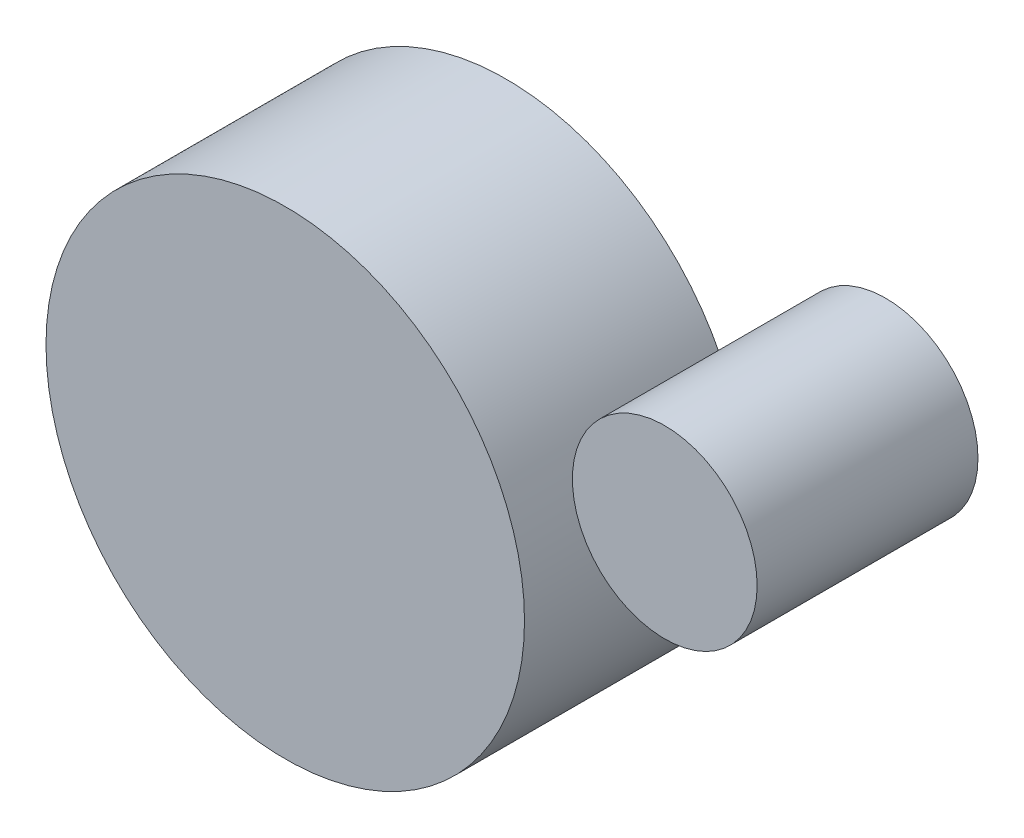
ISO-10303-21;
HEADER;
FILE_DESCRIPTION(('STEP AP214'),'2;1');
FILE_NAME('part.step','',(''),(''),'','','');
FILE_SCHEMA(('AUTOMOTIVE_DESIGN { 1 0 10303 214 1 1 1 1 }'));
ENDSEC;
DATA;
#1=APPLICATION_CONTEXT('core data for automotive mechanical design processes');
#2=APPLICATION_PROTOCOL_DEFINITION('international standard','automotive_design',2000,#1);
#3=PRODUCT_CONTEXT('',#1,'mechanical');
#4=PRODUCT('Part','Part','',(#3));
#5=PRODUCT_RELATED_PRODUCT_CATEGORY('part','',(#4));
#6=PRODUCT_DEFINITION_FORMATION('','',#4);
#7=PRODUCT_DEFINITION_CONTEXT('part definition',#1,'design');
#8=PRODUCT_DEFINITION('design','',#6,#7);
#9=PRODUCT_DEFINITION_SHAPE('','',#8);
#10=(LENGTH_UNIT() NAMED_UNIT(*) SI_UNIT(.MILLI.,.METRE.));
#11=(NAMED_UNIT(*) PLANE_ANGLE_UNIT() SI_UNIT($,.RADIAN.));
#12=(NAMED_UNIT(*) SI_UNIT($,.STERADIAN.) SOLID_ANGLE_UNIT());
#13=UNCERTAINTY_MEASURE_WITH_UNIT(LENGTH_MEASURE(1.E-05),#10,'distance_accuracy_value','');
#14=(GEOMETRIC_REPRESENTATION_CONTEXT(3) GLOBAL_UNCERTAINTY_ASSIGNED_CONTEXT((#13)) GLOBAL_UNIT_ASSIGNED_CONTEXT((#10,
#11,#12)) REPRESENTATION_CONTEXT('',''));
#15=CARTESIAN_POINT('',(0.,0.,0.));
#16=DIRECTION('',(0.,0.,1.));
#17=DIRECTION('',(1.,0.,0.));
#18=AXIS2_PLACEMENT_3D('',#15,#16,#17);
#19=CARTESIAN_POINT('',(-6.65,7.05000000000002,30.));
#20=DIRECTION('',(0.,0.,-1.));
#21=DIRECTION('',(-1.,0.,0.));
#22=AXIS2_PLACEMENT_3D('',#19,#20,#21);
#23=CYLINDRICAL_SURFACE('',#22,32.5000000000002);
#24=CARTESIAN_POINT('',(-6.65,7.05000000000002,30.));
#25=DIRECTION('',(0.,0.,1.));
#26=DIRECTION('',(1.,0.,0.));
#27=AXIS2_PLACEMENT_3D('',#24,#25,#26);
#28=CIRCLE('',#27,32.5000000000002);
#29=CARTESIAN_POINT('',(25.8500000000002,7.05000000000002,30.));
#30=VERTEX_POINT('',#29);
#31=EDGE_CURVE('E11',#30,#30,#28,.T.);
#32=ORIENTED_EDGE('',*,*,#31,.F.);
#33=EDGE_LOOP('',(#32));
#34=FACE_BOUND('',#33,.T.);
#35=CARTESIAN_POINT('',(-6.65,7.05000000000002,0.));
#36=DIRECTION('',(0.,0.,1.));
#37=DIRECTION('',(1.,0.,0.));
#38=AXIS2_PLACEMENT_3D('',#35,#36,#37);
#39=CIRCLE('',#38,32.5000000000002);
#40=CARTESIAN_POINT('',(25.8500000000002,7.05000000000002,0.));
#41=VERTEX_POINT('',#40);
#42=EDGE_CURVE('E42',#41,#41,#39,.T.);
#43=ORIENTED_EDGE('',*,*,#42,.T.);
#44=EDGE_LOOP('',(#43));
#45=FACE_BOUND('',#44,.T.);
#46=ADVANCED_FACE('F39',(#34,#45),#23,.T.);
#47=CARTESIAN_POINT('',(-6.65,7.05000000000002,30.));
#48=DIRECTION('',(0.,0.,1.));
#49=DIRECTION('',(1.,0.,0.));
#50=AXIS2_PLACEMENT_3D('',#47,#48,#49);
#51=PLANE('',#50);
#52=ORIENTED_EDGE('',*,*,#31,.T.);
#53=EDGE_LOOP('',(#52));
#54=FACE_BOUND('',#53,.T.);
#55=ADVANCED_FACE('F54',(#54),#51,.T.);
#56=CARTESIAN_POINT('',(-6.65,7.05000000000002,0.));
#57=DIRECTION('',(0.,0.,1.));
#58=DIRECTION('',(1.,0.,0.));
#59=AXIS2_PLACEMENT_3D('',#56,#57,#58);
#60=PLANE('',#59);
#61=ORIENTED_EDGE('',*,*,#42,.F.);
#62=EDGE_LOOP('',(#61));
#63=FACE_BOUND('',#62,.T.);
#64=ADVANCED_FACE('F52',(#63),#60,.F.);
#65=CLOSED_SHELL('',(#46,#55,#64));
#66=MANIFOLD_SOLID_BREP('B2',#65);
#67=CARTESIAN_POINT('',(44.9,26.9999999999999,30.));
#68=DIRECTION('',(0.,0.,-1.));
#69=DIRECTION('',(-1.,0.,0.));
#70=AXIS2_PLACEMENT_3D('',#67,#68,#69);
#71=CYLINDRICAL_SURFACE('',#70,12.5500000000003);
#72=CARTESIAN_POINT('',(44.9,26.9999999999999,30.));
#73=DIRECTION('',(0.,0.,1.));
#74=DIRECTION('',(1.,0.,0.));
#75=AXIS2_PLACEMENT_3D('',#72,#73,#74);
#76=CIRCLE('',#75,12.5500000000003);
#77=CARTESIAN_POINT('',(57.4500000000003,26.9999999999999,30.));
#78=VERTEX_POINT('',#77);
#79=EDGE_CURVE('E38',#78,#78,#76,.T.);
#80=ORIENTED_EDGE('',*,*,#79,.F.);
#81=EDGE_LOOP('',(#80));
#82=FACE_BOUND('',#81,.T.);
#83=CARTESIAN_POINT('',(44.9,26.9999999999999,0.));
#84=DIRECTION('',(0.,0.,1.));
#85=DIRECTION('',(1.,0.,0.));
#86=AXIS2_PLACEMENT_3D('',#83,#84,#85);
#87=CIRCLE('',#86,12.5500000000003);
#88=CARTESIAN_POINT('',(57.4500000000003,26.9999999999999,0.));
#89=VERTEX_POINT('',#88);
#90=EDGE_CURVE('E83',#89,#89,#87,.T.);
#91=ORIENTED_EDGE('',*,*,#90,.T.);
#92=EDGE_LOOP('',(#91));
#93=FACE_BOUND('',#92,.T.);
#94=ADVANCED_FACE('F80',(#82,#93),#71,.T.);
#95=CARTESIAN_POINT('',(44.9,26.9999999999999,30.));
#96=DIRECTION('',(0.,0.,1.));
#97=DIRECTION('',(1.,0.,0.));
#98=AXIS2_PLACEMENT_3D('',#95,#96,#97);
#99=PLANE('',#98);
#100=ORIENTED_EDGE('',*,*,#79,.T.);
#101=EDGE_LOOP('',(#100));
#102=FACE_BOUND('',#101,.T.);
#103=ADVANCED_FACE('F95',(#102),#99,.T.);
#104=CARTESIAN_POINT('',(44.9,26.9999999999999,0.));
#105=DIRECTION('',(0.,0.,1.));
#106=DIRECTION('',(1.,0.,0.));
#107=AXIS2_PLACEMENT_3D('',#104,#105,#106);
#108=PLANE('',#107);
#109=ORIENTED_EDGE('',*,*,#90,.F.);
#110=EDGE_LOOP('',(#109));
#111=FACE_BOUND('',#110,.T.);
#112=ADVANCED_FACE('F93',(#111),#108,.F.);
#113=CLOSED_SHELL('',(#94,#103,#112));
#114=MANIFOLD_SOLID_BREP('B6',#113);
#115=ADVANCED_BREP_SHAPE_REPRESENTATION('',(#18,#66,#114),#14);
#116=SHAPE_DEFINITION_REPRESENTATION(#9,#115);
ENDSEC;
END-ISO-10303-21;
